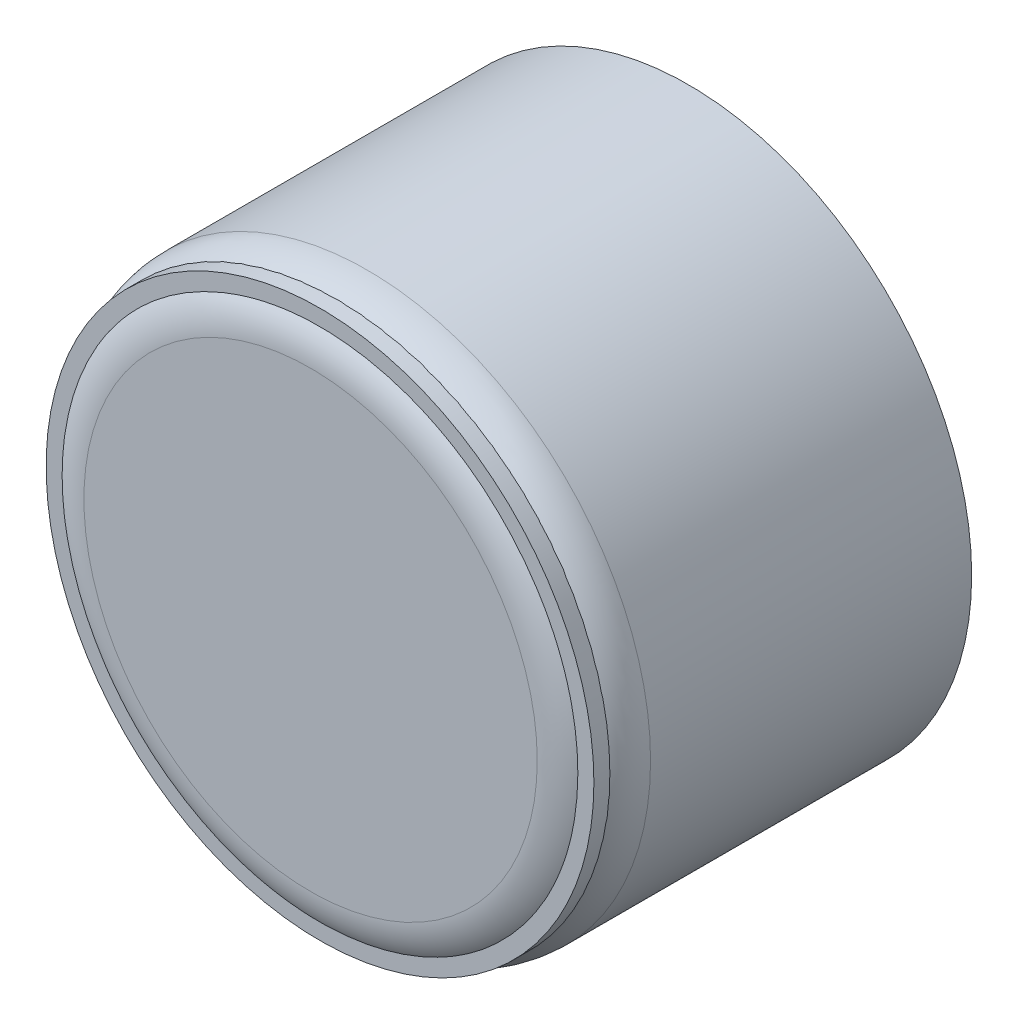
ISO-10303-21;
HEADER;
FILE_DESCRIPTION(('STEP AP214'),'2;1');
FILE_NAME('part.step','',(''),(''),'','','');
FILE_SCHEMA(('AUTOMOTIVE_DESIGN { 1 0 10303 214 1 1 1 1 }'));
ENDSEC;
DATA;
#1=APPLICATION_CONTEXT('core data for automotive mechanical design processes');
#2=APPLICATION_PROTOCOL_DEFINITION('international standard','automotive_design',2000,#1);
#3=PRODUCT_CONTEXT('',#1,'mechanical');
#4=PRODUCT('Part','Part','',(#3));
#5=PRODUCT_RELATED_PRODUCT_CATEGORY('part','',(#4));
#6=PRODUCT_DEFINITION_FORMATION('','',#4);
#7=PRODUCT_DEFINITION_CONTEXT('part definition',#1,'design');
#8=PRODUCT_DEFINITION('design','',#6,#7);
#9=PRODUCT_DEFINITION_SHAPE('','',#8);
#10=(LENGTH_UNIT() NAMED_UNIT(*) SI_UNIT(.MILLI.,.METRE.));
#11=(NAMED_UNIT(*) PLANE_ANGLE_UNIT() SI_UNIT($,.RADIAN.));
#12=(NAMED_UNIT(*) SI_UNIT($,.STERADIAN.) SOLID_ANGLE_UNIT());
#13=UNCERTAINTY_MEASURE_WITH_UNIT(LENGTH_MEASURE(1.E-05),#10,'distance_accuracy_value','');
#14=(GEOMETRIC_REPRESENTATION_CONTEXT(3) GLOBAL_UNCERTAINTY_ASSIGNED_CONTEXT((#13)) GLOBAL_UNIT_ASSIGNED_CONTEXT((#10,
#11,#12)) REPRESENTATION_CONTEXT('',''));
#15=CARTESIAN_POINT('',(0.,0.,0.));
#16=DIRECTION('',(0.,0.,1.));
#17=DIRECTION('',(1.,0.,0.));
#18=AXIS2_PLACEMENT_3D('',#15,#16,#17);
#19=CARTESIAN_POINT('',(0.,0.,20.));
#20=DIRECTION('',(0.,0.,-1.));
#21=DIRECTION('',(-1.,0.,0.));
#22=AXIS2_PLACEMENT_3D('',#19,#20,#21);
#23=CYLINDRICAL_SURFACE('',#22,15.);
#24=CARTESIAN_POINT('',(0.,0.,17.));
#25=DIRECTION('',(0.,0.,1.));
#26=DIRECTION('',(1.,0.,0.));
#27=AXIS2_PLACEMENT_3D('',#24,#25,#26);
#28=CIRCLE('',#27,15.);
#29=CARTESIAN_POINT('',(15.,0.,17.));
#30=VERTEX_POINT('',#29);
#31=EDGE_CURVE('E10',#30,#30,#28,.F.);
#32=ORIENTED_EDGE('',*,*,#31,.T.);
#33=EDGE_LOOP('',(#32));
#34=FACE_BOUND('',#33,.T.);
#35=CARTESIAN_POINT('',(0.,0.,0.));
#36=DIRECTION('',(0.,0.,1.));
#37=DIRECTION('',(1.,0.,0.));
#38=AXIS2_PLACEMENT_3D('',#35,#36,#37);
#39=CIRCLE('',#38,15.);
#40=CARTESIAN_POINT('',(15.,0.,0.));
#41=VERTEX_POINT('',#40);
#42=EDGE_CURVE('E46',#41,#41,#39,.T.);
#43=ORIENTED_EDGE('',*,*,#42,.T.);
#44=EDGE_LOOP('',(#43));
#45=FACE_BOUND('',#44,.T.);
#46=ADVANCED_FACE('F35',(#34,#45),#23,.T.);
#47=CARTESIAN_POINT('',(0.,0.,20.));
#48=DIRECTION('',(0.,0.,1.));
#49=DIRECTION('',(1.,0.,0.));
#50=AXIS2_PLACEMENT_3D('',#47,#48,#49);
#51=PLANE('',#50);
#52=CARTESIAN_POINT('',(0.,0.,20.));
#53=DIRECTION('',(0.,0.,1.));
#54=DIRECTION('',(1.,0.,0.));
#55=AXIS2_PLACEMENT_3D('',#52,#53,#54);
#56=CIRCLE('',#55,12.);
#57=CARTESIAN_POINT('',(12.,0.,20.));
#58=VERTEX_POINT('',#57);
#59=EDGE_CURVE('E42',#58,#58,#56,.T.);
#60=ORIENTED_EDGE('',*,*,#59,.T.);
#61=EDGE_LOOP('',(#60));
#62=FACE_BOUND('',#61,.T.);
#63=ADVANCED_FACE('F74',(#62),#51,.T.);
#64=CARTESIAN_POINT('',(0.,0.,0.));
#65=DIRECTION('',(0.,0.,1.));
#66=DIRECTION('',(1.,0.,0.));
#67=AXIS2_PLACEMENT_3D('',#64,#65,#66);
#68=PLANE('',#67);
#69=CARTESIAN_POINT('',(0.,0.,0.));
#70=DIRECTION('',(0.,0.,1.));
#71=DIRECTION('',(1.,0.,0.));
#72=AXIS2_PLACEMENT_3D('',#69,#70,#71);
#73=CIRCLE('',#72,14.5);
#74=CARTESIAN_POINT('',(14.5,0.,0.));
#75=VERTEX_POINT('',#74);
#76=EDGE_CURVE('E53',#75,#75,#73,.T.);
#77=ORIENTED_EDGE('',*,*,#76,.T.);
#78=EDGE_LOOP('',(#77));
#79=FACE_BOUND('',#78,.T.);
#80=ORIENTED_EDGE('',*,*,#42,.F.);
#81=EDGE_LOOP('',(#80));
#82=FACE_BOUND('',#81,.T.);
#83=ADVANCED_FACE('F70',(#79,#82),#68,.F.);
#84=CARTESIAN_POINT('',(0.,0.,20.));
#85=DIRECTION('',(0.,0.,-1.));
#86=DIRECTION('',(-1.,0.,0.));
#87=AXIS2_PLACEMENT_3D('',#84,#85,#86);
#88=CYLINDRICAL_SURFACE('',#87,14.5);
#89=CARTESIAN_POINT('',(0.,0.,19.5));
#90=DIRECTION('',(0.,0.,1.));
#91=DIRECTION('',(1.,0.,0.));
#92=AXIS2_PLACEMENT_3D('',#89,#90,#91);
#93=CIRCLE('',#92,14.5);
#94=CARTESIAN_POINT('',(14.5,0.,19.5));
#95=VERTEX_POINT('',#94);
#96=EDGE_CURVE('E50',#95,#95,#93,.T.);
#97=ORIENTED_EDGE('',*,*,#96,.T.);
#98=EDGE_LOOP('',(#97));
#99=FACE_BOUND('',#98,.T.);
#100=ORIENTED_EDGE('',*,*,#76,.F.);
#101=EDGE_LOOP('',(#100));
#102=FACE_BOUND('',#101,.T.);
#103=ADVANCED_FACE('F59',(#99,#102),#88,.F.);
#104=CARTESIAN_POINT('',(0.,0.,19.5));
#105=DIRECTION('',(0.,0.,1.));
#106=DIRECTION('',(1.,0.,0.));
#107=AXIS2_PLACEMENT_3D('',#104,#105,#106);
#108=PLANE('',#107);
#109=ORIENTED_EDGE('',*,*,#96,.F.);
#110=EDGE_LOOP('',(#109));
#111=FACE_BOUND('',#110,.T.);
#112=ADVANCED_FACE('F62',(#111),#108,.F.);
#113=CARTESIAN_POINT('',(0.,0.,17.));
#114=DIRECTION('',(0.,0.,1.));
#115=DIRECTION('',(1.,0.,0.));
#116=AXIS2_PLACEMENT_3D('',#113,#114,#115);
#117=TOROIDAL_SURFACE('',#116,12.,3.);
#118=ORIENTED_EDGE('',*,*,#31,.F.);
#119=EDGE_LOOP('',(#118));
#120=FACE_BOUND('',#119,.T.);
#121=ORIENTED_EDGE('',*,*,#59,.F.);
#122=EDGE_LOOP('',(#121));
#123=FACE_BOUND('',#122,.T.);
#124=ADVANCED_FACE('F37',(#120,#123),#117,.T.);
#125=CLOSED_SHELL('',(#46,#63,#83,#103,#112,#124));
#126=MANIFOLD_SOLID_BREP('B2',#125);
#127=ADVANCED_BREP_SHAPE_REPRESENTATION('',(#18,#126),#14);
#128=SHAPE_DEFINITION_REPRESENTATION(#9,#127);
ENDSEC;
END-ISO-10303-21;
